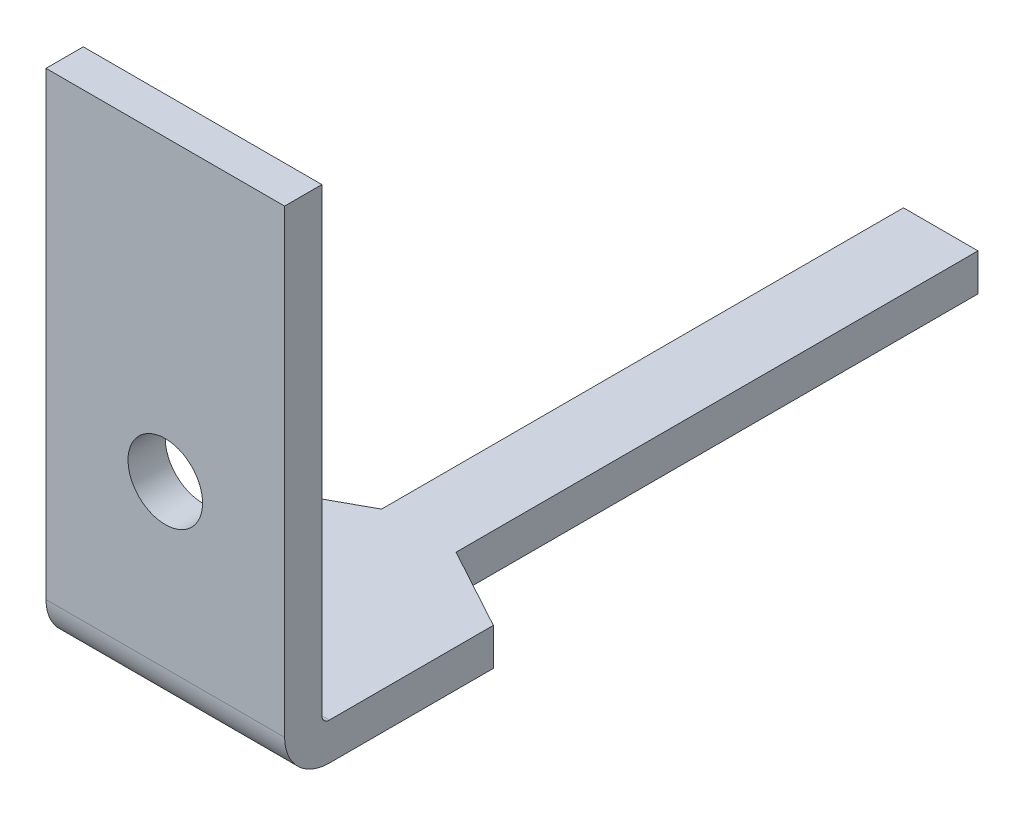
ISO-10303-21;
HEADER;
FILE_DESCRIPTION(('STEP AP214'),'2;1');
FILE_NAME('part.step','',(''),(''),'','','');
FILE_SCHEMA(('AUTOMOTIVE_DESIGN { 1 0 10303 214 1 1 1 1 }'));
ENDSEC;
DATA;
#1=APPLICATION_CONTEXT('core data for automotive mechanical design processes');
#2=APPLICATION_PROTOCOL_DEFINITION('international standard','automotive_design',2000,#1);
#3=PRODUCT_CONTEXT('',#1,'mechanical');
#4=PRODUCT('Part','Part','',(#3));
#5=PRODUCT_RELATED_PRODUCT_CATEGORY('part','',(#4));
#6=PRODUCT_DEFINITION_FORMATION('','',#4);
#7=PRODUCT_DEFINITION_CONTEXT('part definition',#1,'design');
#8=PRODUCT_DEFINITION('design','',#6,#7);
#9=PRODUCT_DEFINITION_SHAPE('','',#8);
#10=(LENGTH_UNIT() NAMED_UNIT(*) SI_UNIT(.MILLI.,.METRE.));
#11=(NAMED_UNIT(*) PLANE_ANGLE_UNIT() SI_UNIT($,.RADIAN.));
#12=(NAMED_UNIT(*) SI_UNIT($,.STERADIAN.) SOLID_ANGLE_UNIT());
#13=UNCERTAINTY_MEASURE_WITH_UNIT(LENGTH_MEASURE(1.E-05),#10,'distance_accuracy_value','');
#14=(GEOMETRIC_REPRESENTATION_CONTEXT(3) GLOBAL_UNCERTAINTY_ASSIGNED_CONTEXT((#13)) GLOBAL_UNIT_ASSIGNED_CONTEXT((#10,
#11,#12)) REPRESENTATION_CONTEXT('',''));
#15=CARTESIAN_POINT('',(0.,0.,0.));
#16=DIRECTION('',(0.,0.,1.));
#17=DIRECTION('',(1.,0.,0.));
#18=AXIS2_PLACEMENT_3D('',#15,#16,#17);
#19=CARTESIAN_POINT('',(1.6,0.25,-5.2));
#20=DIRECTION('',(0.,1.,0.));
#21=DIRECTION('',(0.,0.,1.));
#22=AXIS2_PLACEMENT_3D('',#19,#20,#21);
#23=PLANE('',#22);
#24=DIRECTION('',(0.,0.,1.));
#25=VECTOR('',#24,1.);
#26=CARTESIAN_POINT('',(0.,0.25,-5.2));
#27=LINE('',#26,#25);
#28=CARTESIAN_POINT('',(0.,0.25,-1.4));
#29=VERTEX_POINT('',#28);
#30=CARTESIAN_POINT('',(0.,0.250000000000001,-0.3));
#31=VERTEX_POINT('',#30);
#32=EDGE_CURVE('E117',#29,#31,#27,.T.);
#33=ORIENTED_EDGE('',*,*,#32,.T.);
#34=DIRECTION('',(1.,0.,0.));
#35=VECTOR('',#34,1.);
#36=CARTESIAN_POINT('',(1.6,0.250000000000001,-0.3));
#37=LINE('',#36,#35);
#38=CARTESIAN_POINT('',(1.6,0.250000000000001,-0.3));
#39=VERTEX_POINT('',#38);
#40=EDGE_CURVE('E109',#31,#39,#37,.T.);
#41=ORIENTED_EDGE('',*,*,#40,.T.);
#42=DIRECTION('',(0.,0.,1.));
#43=VECTOR('',#42,1.);
#44=CARTESIAN_POINT('',(1.6,0.25,-5.2));
#45=LINE('',#44,#43);
#46=CARTESIAN_POINT('',(1.6,0.25,-1.4));
#47=VERTEX_POINT('',#46);
#48=EDGE_CURVE('E138',#39,#47,#45,.F.);
#49=ORIENTED_EDGE('',*,*,#48,.T.);
#50=DIRECTION('',(-0.877895572914384,0.,-0.478852130680573));
#51=VECTOR('',#50,1.);
#52=CARTESIAN_POINT('',(1.6,0.25,-1.4));
#53=LINE('',#52,#51);
#54=CARTESIAN_POINT('',(1.05,0.249999999999999,-1.7));
#55=VERTEX_POINT('',#54);
#56=EDGE_CURVE('E140',#47,#55,#53,.T.);
#57=ORIENTED_EDGE('',*,*,#56,.T.);
#58=DIRECTION('',(0.,0.,-1.));
#59=VECTOR('',#58,1.);
#60=CARTESIAN_POINT('',(1.05,0.25,-5.2));
#61=LINE('',#60,#59);
#62=CARTESIAN_POINT('',(1.05,0.25,-5.2));
#63=VERTEX_POINT('',#62);
#64=EDGE_CURVE('E143',#63,#55,#61,.F.);
#65=ORIENTED_EDGE('',*,*,#64,.F.);
#66=DIRECTION('',(1.,0.,0.));
#67=VECTOR('',#66,1.);
#68=CARTESIAN_POINT('',(1.6,0.25,-5.2));
#69=LINE('',#68,#67);
#70=CARTESIAN_POINT('',(0.55,0.25,-5.2));
#71=VERTEX_POINT('',#70);
#72=EDGE_CURVE('E130',#63,#71,#69,.F.);
#73=ORIENTED_EDGE('',*,*,#72,.T.);
#74=DIRECTION('',(0.,0.,1.));
#75=VECTOR('',#74,1.);
#76=CARTESIAN_POINT('',(0.55,0.25,-1.7));
#77=LINE('',#76,#75);
#78=CARTESIAN_POINT('',(0.549999999999944,0.249999999999998,-1.7000000000002));
#79=VERTEX_POINT('',#78);
#80=EDGE_CURVE('E146',#79,#71,#77,.F.);
#81=ORIENTED_EDGE('',*,*,#80,.F.);
#82=DIRECTION('',(-0.877895572914384,0.,0.478852130680573));
#83=VECTOR('',#82,1.);
#84=CARTESIAN_POINT('',(0.55,0.25,-1.7));
#85=LINE('',#84,#83);
#86=EDGE_CURVE('E128',#79,#29,#85,.T.);
#87=ORIENTED_EDGE('',*,*,#86,.T.);
#88=EDGE_LOOP('',(#33,#41,#49,#57,#65,#73,#81,#87));
#89=FACE_BOUND('',#88,.T.);
#90=ADVANCED_FACE('F17',(#89),#23,.T.);
#91=CARTESIAN_POINT('',(1.05,6.407669233036,-5.2));
#92=DIRECTION('',(1.,0.,0.));
#93=DIRECTION('',(0.,0.,-1.));
#94=AXIS2_PLACEMENT_3D('',#91,#92,#93);
#95=PLANE('',#94);
#96=DIRECTION('',(0.,1.,0.));
#97=VECTOR('',#96,1.);
#98=CARTESIAN_POINT('',(1.05,0.25,-5.2));
#99=LINE('',#98,#97);
#100=CARTESIAN_POINT('',(1.05,0.,-5.2));
#101=VERTEX_POINT('',#100);
#102=EDGE_CURVE('E149',#63,#101,#99,.F.);
#103=ORIENTED_EDGE('',*,*,#102,.F.);
#104=ORIENTED_EDGE('',*,*,#64,.T.);
#105=DIRECTION('',(0.,1.,0.));
#106=VECTOR('',#105,1.);
#107=CARTESIAN_POINT('',(1.05,6.407669233036,-1.7));
#108=LINE('',#107,#106);
#109=CARTESIAN_POINT('',(1.05,0.,-1.7));
#110=VERTEX_POINT('',#109);
#111=EDGE_CURVE('E116',#55,#110,#108,.F.);
#112=ORIENTED_EDGE('',*,*,#111,.T.);
#113=DIRECTION('',(0.,0.,-1.));
#114=VECTOR('',#113,1.);
#115=CARTESIAN_POINT('',(1.05,0.,-0.3));
#116=LINE('',#115,#114);
#117=EDGE_CURVE('E170',#101,#110,#116,.F.);
#118=ORIENTED_EDGE('',*,*,#117,.F.);
#119=EDGE_LOOP('',(#103,#104,#112,#118));
#120=FACE_BOUND('',#119,.T.);
#121=ADVANCED_FACE('F288',(#120),#95,.T.);
#122=CARTESIAN_POINT('',(0.55,6.407669233036,-1.7));
#123=DIRECTION('',(-1.,0.,0.));
#124=DIRECTION('',(0.,0.,1.));
#125=AXIS2_PLACEMENT_3D('',#122,#123,#124);
#126=PLANE('',#125);
#127=DIRECTION('',(0.,1.,0.));
#128=VECTOR('',#127,1.);
#129=CARTESIAN_POINT('',(0.549999999999833,6.407669233036,-1.70000000000031));
#130=LINE('',#129,#128);
#131=CARTESIAN_POINT('',(0.549999999999944,0.,-1.7000000000001));
#132=VERTEX_POINT('',#131);
#133=EDGE_CURVE('E168',#79,#132,#130,.F.);
#134=ORIENTED_EDGE('',*,*,#133,.F.);
#135=ORIENTED_EDGE('',*,*,#80,.T.);
#136=DIRECTION('',(0.,1.,0.));
#137=VECTOR('',#136,1.);
#138=CARTESIAN_POINT('',(0.55,0.25,-5.2));
#139=LINE('',#138,#137);
#140=CARTESIAN_POINT('',(0.55,0.,-5.2));
#141=VERTEX_POINT('',#140);
#142=EDGE_CURVE('E152',#141,#71,#139,.T.);
#143=ORIENTED_EDGE('',*,*,#142,.F.);
#144=DIRECTION('',(0.,0.,-1.));
#145=VECTOR('',#144,1.);
#146=CARTESIAN_POINT('',(0.55,0.,-0.3));
#147=LINE('',#146,#145);
#148=EDGE_CURVE('E205',#132,#141,#147,.T.);
#149=ORIENTED_EDGE('',*,*,#148,.F.);
#150=EDGE_LOOP('',(#134,#135,#143,#149));
#151=FACE_BOUND('',#150,.T.);
#152=ADVANCED_FACE('F279',(#151),#126,.T.);
#153=CARTESIAN_POINT('',(1.6,0.25,-5.2));
#154=DIRECTION('',(0.,0.,-1.));
#155=DIRECTION('',(-1.,0.,0.));
#156=AXIS2_PLACEMENT_3D('',#153,#154,#155);
#157=PLANE('',#156);
#158=DIRECTION('',(1.,0.,0.));
#159=VECTOR('',#158,1.);
#160=CARTESIAN_POINT('',(1.6,0.,-5.2));
#161=LINE('',#160,#159);
#162=EDGE_CURVE('E208',#141,#101,#161,.T.);
#163=ORIENTED_EDGE('',*,*,#162,.F.);
#164=ORIENTED_EDGE('',*,*,#142,.T.);
#165=ORIENTED_EDGE('',*,*,#72,.F.);
#166=ORIENTED_EDGE('',*,*,#102,.T.);
#167=EDGE_LOOP('',(#163,#164,#165,#166));
#168=FACE_BOUND('',#167,.T.);
#169=ADVANCED_FACE('F280',(#168),#157,.T.);
#170=CARTESIAN_POINT('',(1.6,0.3,-0.3));
#171=DIRECTION('',(1.,0.,0.));
#172=DIRECTION('',(0.,0.,-1.));
#173=AXIS2_PLACEMENT_3D('',#170,#171,#172);
#174=CYLINDRICAL_SURFACE('',#173,0.3);
#175=CARTESIAN_POINT('',(1.6,0.3,-0.3));
#176=DIRECTION('',(1.,0.,0.));
#177=DIRECTION('',(0.,0.,-1.));
#178=AXIS2_PLACEMENT_3D('',#175,#176,#177);
#179=CIRCLE('',#178,0.3);
#180=CARTESIAN_POINT('',(1.6,0.,-0.3));
#181=VERTEX_POINT('',#180);
#182=CARTESIAN_POINT('',(1.6,0.3,0.));
#183=VERTEX_POINT('',#182);
#184=EDGE_CURVE('E167',#181,#183,#179,.F.);
#185=ORIENTED_EDGE('',*,*,#184,.T.);
#186=DIRECTION('',(1.,0.,0.));
#187=VECTOR('',#186,1.);
#188=CARTESIAN_POINT('',(1.6,0.3,0.));
#189=LINE('',#188,#187);
#190=CARTESIAN_POINT('',(0.,0.3,0.));
#191=VERTEX_POINT('',#190);
#192=EDGE_CURVE('E196',#191,#183,#189,.T.);
#193=ORIENTED_EDGE('',*,*,#192,.F.);
#194=CARTESIAN_POINT('',(0.,0.3,-0.3));
#195=DIRECTION('',(1.,0.,0.));
#196=DIRECTION('',(0.,0.,-1.));
#197=AXIS2_PLACEMENT_3D('',#194,#195,#196);
#198=CIRCLE('',#197,0.3);
#199=CARTESIAN_POINT('',(0.,0.,-0.3));
#200=VERTEX_POINT('',#199);
#201=EDGE_CURVE('E20',#191,#200,#198,.T.);
#202=ORIENTED_EDGE('',*,*,#201,.T.);
#203=DIRECTION('',(1.,0.,0.));
#204=VECTOR('',#203,1.);
#205=CARTESIAN_POINT('',(1.6,0.,-0.3));
#206=LINE('',#205,#204);
#207=EDGE_CURVE('E202',#181,#200,#206,.F.);
#208=ORIENTED_EDGE('',*,*,#207,.F.);
#209=EDGE_LOOP('',(#185,#193,#202,#208));
#210=FACE_BOUND('',#209,.T.);
#211=ADVANCED_FACE('F293',(#210),#174,.T.);
#212=CARTESIAN_POINT('',(0.,6.407669233036,-1.4));
#213=DIRECTION('',(-0.478852130681064,0.,-0.877895572914117));
#214=DIRECTION('',(-0.877895572914117,0.,0.478852130681064));
#215=AXIS2_PLACEMENT_3D('',#212,#213,#214);
#216=PLANE('',#215);
#217=DIRECTION('',(0.,1.,0.));
#218=VECTOR('',#217,1.);
#219=CARTESIAN_POINT('',(0.,0.3,-1.4));
#220=LINE('',#219,#218);
#221=CARTESIAN_POINT('',(0.,0.,-1.4));
#222=VERTEX_POINT('',#221);
#223=EDGE_CURVE('E165',#29,#222,#220,.F.);
#224=ORIENTED_EDGE('',*,*,#223,.F.);
#225=ORIENTED_EDGE('',*,*,#86,.F.);
#226=ORIENTED_EDGE('',*,*,#133,.T.);
#227=DIRECTION('',(0.877895572914384,0.,-0.478852130680573));
#228=VECTOR('',#227,1.);
#229=CARTESIAN_POINT('',(0.,0.,-1.4));
#230=LINE('',#229,#228);
#231=EDGE_CURVE('E73',#222,#132,#230,.T.);
#232=ORIENTED_EDGE('',*,*,#231,.F.);
#233=EDGE_LOOP('',(#224,#225,#226,#232));
#234=FACE_BOUND('',#233,.T.);
#235=ADVANCED_FACE('F284',(#234),#216,.T.);
#236=CARTESIAN_POINT('',(1.6,0.,-0.3));
#237=DIRECTION('',(0.,-1.,0.));
#238=DIRECTION('',(0.,0.,-1.));
#239=AXIS2_PLACEMENT_3D('',#236,#237,#238);
#240=PLANE('',#239);
#241=ORIENTED_EDGE('',*,*,#148,.T.);
#242=ORIENTED_EDGE('',*,*,#162,.T.);
#243=ORIENTED_EDGE('',*,*,#117,.T.);
#244=DIRECTION('',(-0.877895572914117,0.,-0.478852130681064));
#245=VECTOR('',#244,1.);
#246=CARTESIAN_POINT('',(1.05,0.,-1.7));
#247=LINE('',#246,#245);
#248=CARTESIAN_POINT('',(1.6,0.,-1.39999999999992));
#249=VERTEX_POINT('',#248);
#250=EDGE_CURVE('E166',#249,#110,#247,.T.);
#251=ORIENTED_EDGE('',*,*,#250,.F.);
#252=DIRECTION('',(0.,0.,-1.));
#253=VECTOR('',#252,1.);
#254=CARTESIAN_POINT('',(1.6,0.,-0.3));
#255=LINE('',#254,#253);
#256=EDGE_CURVE('E199',#249,#181,#255,.F.);
#257=ORIENTED_EDGE('',*,*,#256,.T.);
#258=ORIENTED_EDGE('',*,*,#207,.T.);
#259=DIRECTION('',(0.,0.,1.));
#260=VECTOR('',#259,1.);
#261=CARTESIAN_POINT('',(0.,0.,-0.3));
#262=LINE('',#261,#260);
#263=EDGE_CURVE('E214',#222,#200,#262,.T.);
#264=ORIENTED_EDGE('',*,*,#263,.F.);
#265=ORIENTED_EDGE('',*,*,#231,.T.);
#266=EDGE_LOOP('',(#241,#242,#243,#251,#257,#258,#264,#265));
#267=FACE_BOUND('',#266,.T.);
#268=ADVANCED_FACE('F283',(#267),#240,.T.);
#269=CARTESIAN_POINT('',(1.6,0.3,0.));
#270=DIRECTION('',(0.,0.,1.));
#271=DIRECTION('',(0.,-1.,0.));
#272=AXIS2_PLACEMENT_3D('',#269,#270,#271);
#273=PLANE('',#272);
#274=DIRECTION('',(0.,1.,0.));
#275=VECTOR('',#274,1.);
#276=CARTESIAN_POINT('',(1.6,0.3,0.));
#277=LINE('',#276,#275);
#278=CARTESIAN_POINT('',(1.6,3.385,0.));
#279=VERTEX_POINT('',#278);
#280=EDGE_CURVE('E229',#183,#279,#277,.T.);
#281=ORIENTED_EDGE('',*,*,#280,.T.);
#282=DIRECTION('',(1.,0.,0.));
#283=VECTOR('',#282,1.);
#284=CARTESIAN_POINT('',(1.6,3.385,0.));
#285=LINE('',#284,#283);
#286=CARTESIAN_POINT('',(0.,3.385,0.));
#287=VERTEX_POINT('',#286);
#288=EDGE_CURVE('E226',#287,#279,#285,.T.);
#289=ORIENTED_EDGE('',*,*,#288,.F.);
#290=DIRECTION('',(0.,1.,0.));
#291=VECTOR('',#290,1.);
#292=CARTESIAN_POINT('',(0.,0.3,0.));
#293=LINE('',#292,#291);
#294=EDGE_CURVE('E234',#191,#287,#293,.T.);
#295=ORIENTED_EDGE('',*,*,#294,.F.);
#296=ORIENTED_EDGE('',*,*,#192,.T.);
#297=EDGE_LOOP('',(#281,#289,#295,#296));
#298=FACE_BOUND('',#297,.T.);
#299=CARTESIAN_POINT('',(0.8,1.385,0.));
#300=DIRECTION('',(0.,0.,-1.));
#301=DIRECTION('',(0.,1.,0.));
#302=AXIS2_PLACEMENT_3D('',#299,#300,#301);
#303=CIRCLE('',#302,0.25);
#304=CARTESIAN_POINT('',(0.8,1.635,0.));
#305=VERTEX_POINT('',#304);
#306=EDGE_CURVE('E163',#305,#305,#303,.T.);
#307=ORIENTED_EDGE('',*,*,#306,.T.);
#308=EDGE_LOOP('',(#307));
#309=FACE_BOUND('',#308,.T.);
#310=ADVANCED_FACE('F263',(#298,#309),#273,.T.);
#311=CARTESIAN_POINT('',(1.05,6.407669233036,-1.7));
#312=DIRECTION('',(0.478852130681064,0.,-0.877895572914117));
#313=DIRECTION('',(-0.877895572914117,0.,-0.478852130681064));
#314=AXIS2_PLACEMENT_3D('',#311,#312,#313);
#315=PLANE('',#314);
#316=ORIENTED_EDGE('',*,*,#111,.F.);
#317=ORIENTED_EDGE('',*,*,#56,.F.);
#318=DIRECTION('',(0.,1.,0.));
#319=VECTOR('',#318,1.);
#320=CARTESIAN_POINT('',(1.6,0.3,-1.4));
#321=LINE('',#320,#319);
#322=EDGE_CURVE('E162',#47,#249,#321,.F.);
#323=ORIENTED_EDGE('',*,*,#322,.T.);
#324=ORIENTED_EDGE('',*,*,#250,.T.);
#325=EDGE_LOOP('',(#316,#317,#323,#324));
#326=FACE_BOUND('',#325,.T.);
#327=ADVANCED_FACE('F291',(#326),#315,.T.);
#328=CARTESIAN_POINT('',(0.8,1.385,-6.407669233036));
#329=DIRECTION('',(0.,0.,-1.));
#330=DIRECTION('',(0.,1.,0.));
#331=AXIS2_PLACEMENT_3D('',#328,#329,#330);
#332=CYLINDRICAL_SURFACE('',#331,0.25);
#333=CARTESIAN_POINT('',(0.8,1.385,-0.25));
#334=DIRECTION('',(0.,0.,-1.));
#335=DIRECTION('',(0.,1.,0.));
#336=AXIS2_PLACEMENT_3D('',#333,#334,#335);
#337=CIRCLE('',#336,0.25);
#338=CARTESIAN_POINT('',(0.8,1.635,-0.25));
#339=VERTEX_POINT('',#338);
#340=EDGE_CURVE('E124',#339,#339,#337,.F.);
#341=ORIENTED_EDGE('',*,*,#340,.F.);
#342=EDGE_LOOP('',(#341));
#343=FACE_BOUND('',#342,.T.);
#344=ORIENTED_EDGE('',*,*,#306,.F.);
#345=EDGE_LOOP('',(#344));
#346=FACE_BOUND('',#345,.T.);
#347=ADVANCED_FACE('F316',(#343,#346),#332,.F.);
#348=CARTESIAN_POINT('',(0.,0.3,-0.3));
#349=DIRECTION('',(-1.,0.,0.));
#350=DIRECTION('',(0.,0.,1.));
#351=AXIS2_PLACEMENT_3D('',#348,#349,#350);
#352=PLANE('',#351);
#353=CARTESIAN_POINT('',(0.,0.3,-0.3));
#354=DIRECTION('',(1.,0.,0.));
#355=DIRECTION('',(0.,0.,-1.));
#356=AXIS2_PLACEMENT_3D('',#353,#354,#355);
#357=CIRCLE('',#356,0.05);
#358=CARTESIAN_POINT('',(0.,0.3,-0.25));
#359=VERTEX_POINT('',#358);
#360=EDGE_CURVE('E112',#359,#31,#357,.T.);
#361=ORIENTED_EDGE('',*,*,#360,.T.);
#362=ORIENTED_EDGE('',*,*,#32,.F.);
#363=ORIENTED_EDGE('',*,*,#223,.T.);
#364=ORIENTED_EDGE('',*,*,#263,.T.);
#365=ORIENTED_EDGE('',*,*,#201,.F.);
#366=ORIENTED_EDGE('',*,*,#294,.T.);
#367=DIRECTION('',(0.,0.,1.));
#368=VECTOR('',#367,1.);
#369=CARTESIAN_POINT('',(0.,3.385,-0.25));
#370=LINE('',#369,#368);
#371=CARTESIAN_POINT('',(0.,3.385,-0.25));
#372=VERTEX_POINT('',#371);
#373=EDGE_CURVE('E230',#372,#287,#370,.T.);
#374=ORIENTED_EDGE('',*,*,#373,.F.);
#375=DIRECTION('',(0.,1.,0.));
#376=VECTOR('',#375,1.);
#377=CARTESIAN_POINT('',(0.,0.3,-0.25));
#378=LINE('',#377,#376);
#379=EDGE_CURVE('E123',#359,#372,#378,.T.);
#380=ORIENTED_EDGE('',*,*,#379,.F.);
#381=EDGE_LOOP('',(#361,#362,#363,#364,#365,#366,#374,#380));
#382=FACE_BOUND('',#381,.T.);
#383=ADVANCED_FACE('F119',(#382),#352,.T.);
#384=CARTESIAN_POINT('',(1.6,3.385,-0.25));
#385=DIRECTION('',(0.,1.,0.));
#386=DIRECTION('',(0.,0.,1.));
#387=AXIS2_PLACEMENT_3D('',#384,#385,#386);
#388=PLANE('',#387);
#389=DIRECTION('',(0.,0.,1.));
#390=VECTOR('',#389,1.);
#391=CARTESIAN_POINT('',(1.6,3.385,-0.3));
#392=LINE('',#391,#390);
#393=CARTESIAN_POINT('',(1.6,3.385,-0.25));
#394=VERTEX_POINT('',#393);
#395=EDGE_CURVE('E191',#279,#394,#392,.F.);
#396=ORIENTED_EDGE('',*,*,#395,.T.);
#397=DIRECTION('',(1.,0.,0.));
#398=VECTOR('',#397,1.);
#399=CARTESIAN_POINT('',(1.6,3.385,-0.25));
#400=LINE('',#399,#398);
#401=EDGE_CURVE('E241',#372,#394,#400,.T.);
#402=ORIENTED_EDGE('',*,*,#401,.F.);
#403=ORIENTED_EDGE('',*,*,#373,.T.);
#404=ORIENTED_EDGE('',*,*,#288,.T.);
#405=EDGE_LOOP('',(#396,#402,#403,#404));
#406=FACE_BOUND('',#405,.T.);
#407=ADVANCED_FACE('F269',(#406),#388,.T.);
#408=CARTESIAN_POINT('',(1.6,0.3,-0.3));
#409=DIRECTION('',(-1.,0.,0.));
#410=DIRECTION('',(0.,0.,1.));
#411=AXIS2_PLACEMENT_3D('',#408,#409,#410);
#412=PLANE('',#411);
#413=ORIENTED_EDGE('',*,*,#48,.F.);
#414=CARTESIAN_POINT('',(1.6,0.3,-0.3));
#415=DIRECTION('',(1.,0.,0.));
#416=DIRECTION('',(0.,0.,-1.));
#417=AXIS2_PLACEMENT_3D('',#414,#415,#416);
#418=CIRCLE('',#417,0.05);
#419=CARTESIAN_POINT('',(1.6,0.3,-0.25));
#420=VERTEX_POINT('',#419);
#421=EDGE_CURVE('E35',#39,#420,#418,.F.);
#422=ORIENTED_EDGE('',*,*,#421,.T.);
#423=DIRECTION('',(0.,1.,0.));
#424=VECTOR('',#423,1.);
#425=CARTESIAN_POINT('',(1.6,0.3,-0.25));
#426=LINE('',#425,#424);
#427=EDGE_CURVE('E26',#394,#420,#426,.F.);
#428=ORIENTED_EDGE('',*,*,#427,.F.);
#429=ORIENTED_EDGE('',*,*,#395,.F.);
#430=ORIENTED_EDGE('',*,*,#280,.F.);
#431=ORIENTED_EDGE('',*,*,#184,.F.);
#432=ORIENTED_EDGE('',*,*,#256,.F.);
#433=ORIENTED_EDGE('',*,*,#322,.F.);
#434=EDGE_LOOP('',(#413,#422,#428,#429,#430,#431,#432,#433));
#435=FACE_BOUND('',#434,.T.);
#436=ADVANCED_FACE('F271',(#435),#412,.F.);
#437=CARTESIAN_POINT('',(1.6,0.3,-0.3));
#438=DIRECTION('',(1.,0.,0.));
#439=DIRECTION('',(0.,0.,-1.));
#440=AXIS2_PLACEMENT_3D('',#437,#438,#439);
#441=CYLINDRICAL_SURFACE('',#440,0.05);
#442=DIRECTION('',(1.,0.,0.));
#443=VECTOR('',#442,1.);
#444=CARTESIAN_POINT('',(1.6,0.3,-0.25));
#445=LINE('',#444,#443);
#446=EDGE_CURVE('E11',#420,#359,#445,.F.);
#447=ORIENTED_EDGE('',*,*,#446,.F.);
#448=ORIENTED_EDGE('',*,*,#421,.F.);
#449=ORIENTED_EDGE('',*,*,#40,.F.);
#450=ORIENTED_EDGE('',*,*,#360,.F.);
#451=EDGE_LOOP('',(#447,#448,#449,#450));
#452=FACE_BOUND('',#451,.T.);
#453=ADVANCED_FACE('F111',(#452),#441,.F.);
#454=CARTESIAN_POINT('',(1.6,0.3,-0.25));
#455=DIRECTION('',(0.,0.,-1.));
#456=DIRECTION('',(0.,1.,0.));
#457=AXIS2_PLACEMENT_3D('',#454,#455,#456);
#458=PLANE('',#457);
#459=ORIENTED_EDGE('',*,*,#427,.T.);
#460=ORIENTED_EDGE('',*,*,#446,.T.);
#461=ORIENTED_EDGE('',*,*,#379,.T.);
#462=ORIENTED_EDGE('',*,*,#401,.T.);
#463=EDGE_LOOP('',(#459,#460,#461,#462));
#464=FACE_BOUND('',#463,.T.);
#465=ORIENTED_EDGE('',*,*,#340,.T.);
#466=EDGE_LOOP('',(#465));
#467=FACE_BOUND('',#466,.T.);
#468=ADVANCED_FACE('F273',(#464,#467),#458,.T.);
#469=CLOSED_SHELL('',(#90,#121,#152,#169,#211,#235,#268,#310,#327,#347,#383,#407,#436,#453,#468));
#470=MANIFOLD_SOLID_BREP('B1',#469);
#471=ADVANCED_BREP_SHAPE_REPRESENTATION('',(#18,#470),#14);
#472=SHAPE_DEFINITION_REPRESENTATION(#9,#471);
ENDSEC;
END-ISO-10303-21;
